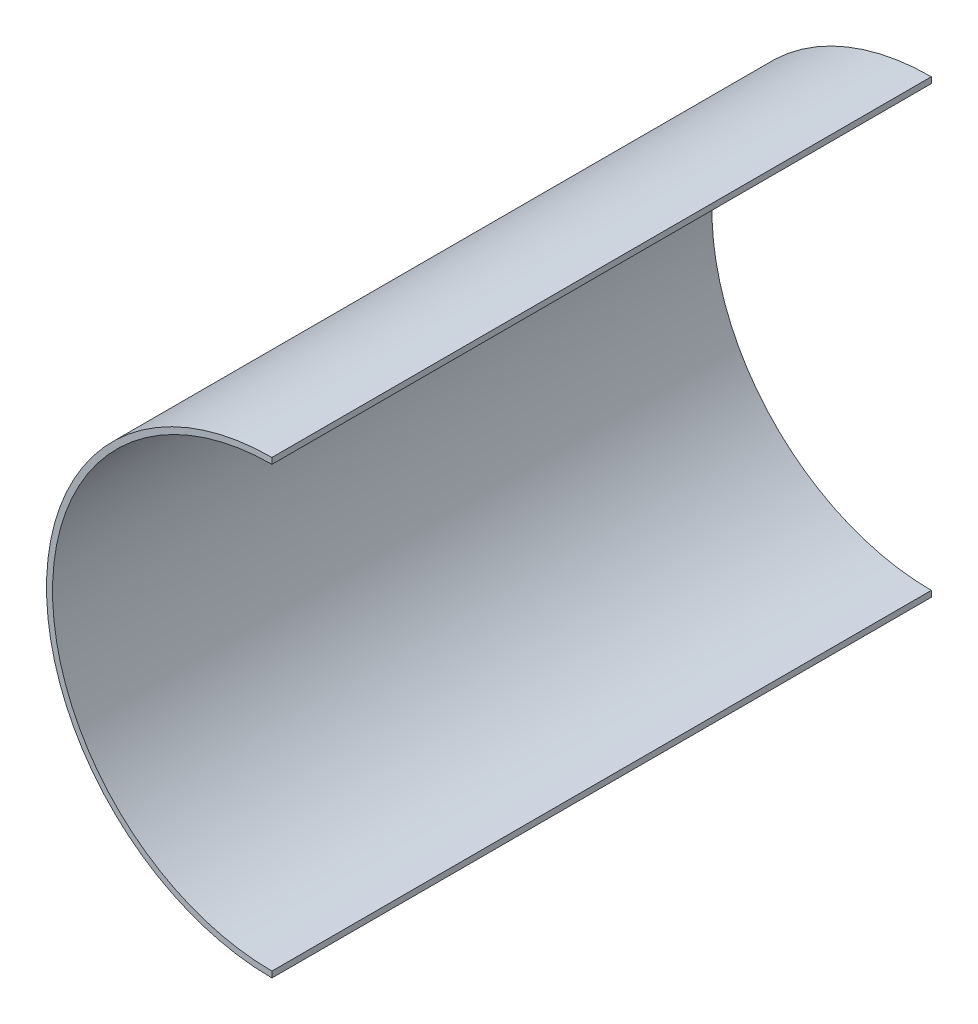
ISO-10303-21;
HEADER;
FILE_DESCRIPTION(('STEP AP214'),'2;1');
FILE_NAME('part.step','',(''),(''),'','','');
FILE_SCHEMA(('AUTOMOTIVE_DESIGN { 1 0 10303 214 1 1 1 1 }'));
ENDSEC;
DATA;
#1=APPLICATION_CONTEXT('core data for automotive mechanical design processes');
#2=APPLICATION_PROTOCOL_DEFINITION('international standard','automotive_design',2000,#1);
#3=PRODUCT_CONTEXT('',#1,'mechanical');
#4=PRODUCT('Part','Part','',(#3));
#5=PRODUCT_RELATED_PRODUCT_CATEGORY('part','',(#4));
#6=PRODUCT_DEFINITION_FORMATION('','',#4);
#7=PRODUCT_DEFINITION_CONTEXT('part definition',#1,'design');
#8=PRODUCT_DEFINITION('design','',#6,#7);
#9=PRODUCT_DEFINITION_SHAPE('','',#8);
#10=(LENGTH_UNIT() NAMED_UNIT(*) SI_UNIT(.MILLI.,.METRE.));
#11=(NAMED_UNIT(*) PLANE_ANGLE_UNIT() SI_UNIT($,.RADIAN.));
#12=(NAMED_UNIT(*) SI_UNIT($,.STERADIAN.) SOLID_ANGLE_UNIT());
#13=UNCERTAINTY_MEASURE_WITH_UNIT(LENGTH_MEASURE(1.E-05),#10,'distance_accuracy_value','');
#14=(GEOMETRIC_REPRESENTATION_CONTEXT(3) GLOBAL_UNCERTAINTY_ASSIGNED_CONTEXT((#13)) GLOBAL_UNIT_ASSIGNED_CONTEXT((#10,
#11,#12)) REPRESENTATION_CONTEXT('',''));
#15=CARTESIAN_POINT('',(0.,0.,0.));
#16=DIRECTION('',(0.,0.,1.));
#17=DIRECTION('',(1.,0.,0.));
#18=AXIS2_PLACEMENT_3D('',#15,#16,#17);
#19=CARTESIAN_POINT('',(0.,0.,448.06869685399));
#20=DIRECTION('',(0.,0.,-1.));
#21=DIRECTION('',(-1.,0.,0.));
#22=AXIS2_PLACEMENT_3D('',#19,#20,#21);
#23=CYLINDRICAL_SURFACE('',#22,75.);
#24=DIRECTION('',(0.,0.,-1.));
#25=VECTOR('',#24,1.);
#26=CARTESIAN_POINT('',(-2.45324106463415E-12,75.,448.06869685399));
#27=LINE('',#26,#25);
#28=CARTESIAN_POINT('',(0.,75.,16.5516691683784));
#29=VERTEX_POINT('',#28);
#30=CARTESIAN_POINT('',(4.44522754626437E-12,75.0000000000034,235.936662498026));
#31=VERTEX_POINT('',#30);
#32=EDGE_CURVE('E64',#29,#31,#27,.F.);
#33=ORIENTED_EDGE('',*,*,#32,.F.);
#34=CARTESIAN_POINT('',(0.,0.,16.5516691683784));
#35=DIRECTION('',(0.,0.,-1.));
#36=DIRECTION('',(-1.,0.,0.));
#37=AXIS2_PLACEMENT_3D('',#34,#35,#36);
#38=CIRCLE('',#37,75.);
#39=CARTESIAN_POINT('',(0.,-75.,16.5516691683783));
#40=VERTEX_POINT('',#39);
#41=EDGE_CURVE('E99',#40,#29,#38,.T.);
#42=ORIENTED_EDGE('',*,*,#41,.F.);
#43=DIRECTION('',(0.,0.,-1.));
#44=VECTOR('',#43,1.);
#45=CARTESIAN_POINT('',(-2.43487136264694E-12,-75.,448.06869685399));
#46=LINE('',#45,#44);
#47=CARTESIAN_POINT('',(-2.43487136264694E-12,-74.9999999999966,235.936662498026));
#48=VERTEX_POINT('',#47);
#49=EDGE_CURVE('E103',#48,#40,#46,.T.);
#50=ORIENTED_EDGE('',*,*,#49,.F.);
#51=CARTESIAN_POINT('',(4.49323060614543E-12,3.39843537323899E-12,235.936662498026));
#52=DIRECTION('',(0.,0.,1.));
#53=DIRECTION('',(-0.231139563416452,0.972920604275422,0.));
#54=AXIS2_PLACEMENT_3D('',#51,#52,#53);
#55=CIRCLE('',#54,75.);
#56=EDGE_CURVE('E97',#31,#48,#55,.T.);
#57=ORIENTED_EDGE('',*,*,#56,.F.);
#58=EDGE_LOOP('',(#33,#42,#50,#57));
#59=FACE_BOUND('',#58,.T.);
#60=ADVANCED_FACE('F43',(#59),#23,.T.);
#61=CARTESIAN_POINT('',(0.,0.,448.06869685399));
#62=DIRECTION('',(0.,0.,-1.));
#63=DIRECTION('',(-1.,0.,0.));
#64=AXIS2_PLACEMENT_3D('',#61,#62,#63);
#65=CYLINDRICAL_SURFACE('',#64,73.);
#66=CARTESIAN_POINT('',(0.,0.,16.5516691683784));
#67=DIRECTION('',(0.,0.,-1.));
#68=DIRECTION('',(-1.,0.,0.));
#69=AXIS2_PLACEMENT_3D('',#66,#67,#68);
#70=CIRCLE('',#69,73.);
#71=CARTESIAN_POINT('',(0.,-73.,16.5516691683783));
#72=VERTEX_POINT('',#71);
#73=CARTESIAN_POINT('',(0.,73.,16.5516691683784));
#74=VERTEX_POINT('',#73);
#75=EDGE_CURVE('E93',#72,#74,#70,.T.);
#76=ORIENTED_EDGE('',*,*,#75,.T.);
#77=DIRECTION('',(0.,0.,-1.));
#78=VECTOR('',#77,1.);
#79=CARTESIAN_POINT('',(-2.45299613527432E-12,73.,448.06869685399));
#80=LINE('',#79,#78);
#81=CARTESIAN_POINT('',(-2.45299613527432E-12,73.0000000000033,235.936662498026));
#82=VERTEX_POINT('',#81);
#83=EDGE_CURVE('E81',#74,#82,#80,.F.);
#84=ORIENTED_EDGE('',*,*,#83,.T.);
#85=CARTESIAN_POINT('',(4.49323060614543E-12,3.39843537323899E-12,235.936662498026));
#86=DIRECTION('',(0.,0.,1.));
#87=DIRECTION('',(-0.231139563416452,0.972920604275422,0.));
#88=AXIS2_PLACEMENT_3D('',#85,#86,#87);
#89=CIRCLE('',#88,73.);
#90=CARTESIAN_POINT('',(4.46335231889175E-12,-72.9999999999966,235.936662498026));
#91=VERTEX_POINT('',#90);
#92=EDGE_CURVE('E91',#82,#91,#89,.T.);
#93=ORIENTED_EDGE('',*,*,#92,.T.);
#94=DIRECTION('',(0.,0.,-1.));
#95=VECTOR('',#94,1.);
#96=CARTESIAN_POINT('',(-2.43511629200677E-12,-73.,448.06869685399));
#97=LINE('',#96,#95);
#98=EDGE_CURVE('E57',#91,#72,#97,.T.);
#99=ORIENTED_EDGE('',*,*,#98,.T.);
#100=EDGE_LOOP('',(#76,#84,#93,#99));
#101=FACE_BOUND('',#100,.T.);
#102=ADVANCED_FACE('F90',(#101),#65,.F.);
#103=CARTESIAN_POINT('',(0.,0.,16.5516691683784));
#104=DIRECTION('',(0.,0.,-1.));
#105=DIRECTION('',(-1.,0.,0.));
#106=AXIS2_PLACEMENT_3D('',#103,#104,#105);
#107=PLANE('',#106);
#108=DIRECTION('',(0.,1.,0.));
#109=VECTOR('',#108,1.);
#110=CARTESIAN_POINT('',(0.,0.,16.5516691683784));
#111=LINE('',#110,#109);
#112=EDGE_CURVE('E109',#40,#72,#111,.T.);
#113=ORIENTED_EDGE('',*,*,#112,.F.);
#114=ORIENTED_EDGE('',*,*,#41,.T.);
#115=EDGE_CURVE('E94',#74,#29,#111,.T.);
#116=ORIENTED_EDGE('',*,*,#115,.F.);
#117=ORIENTED_EDGE('',*,*,#75,.F.);
#118=EDGE_LOOP('',(#113,#114,#116,#117));
#119=FACE_BOUND('',#118,.T.);
#120=ADVANCED_FACE('F108',(#119),#107,.T.);
#121=CARTESIAN_POINT('',(4.45441239725797E-12,3.38921321902062E-12,235.936662498026));
#122=DIRECTION('',(0.,0.,1.));
#123=DIRECTION('',(-0.231139563416452,0.972920604275422,0.));
#124=AXIS2_PLACEMENT_3D('',#121,#122,#123);
#125=PLANE('',#124);
#126=DIRECTION('',(0.,-1.,0.));
#127=VECTOR('',#126,1.);
#128=CARTESIAN_POINT('',(4.45441239725797E-12,3.38921321902062E-12,235.936662498026));
#129=LINE('',#128,#127);
#130=EDGE_CURVE('E12',#31,#82,#129,.T.);
#131=ORIENTED_EDGE('',*,*,#130,.F.);
#132=ORIENTED_EDGE('',*,*,#56,.T.);
#133=EDGE_CURVE('E46',#91,#48,#129,.T.);
#134=ORIENTED_EDGE('',*,*,#133,.F.);
#135=ORIENTED_EDGE('',*,*,#92,.F.);
#136=EDGE_LOOP('',(#131,#132,#134,#135));
#137=FACE_BOUND('',#136,.T.);
#138=ADVANCED_FACE('F96',(#137),#125,.T.);
#139=CARTESIAN_POINT('',(-2.43303439244822E-12,-90.0000000000006,-155.063337501974));
#140=DIRECTION('',(-1.,0.,0.));
#141=DIRECTION('',(0.,-1.,0.));
#142=AXIS2_PLACEMENT_3D('',#139,#140,#141);
#143=PLANE('',#142);
#144=ORIENTED_EDGE('',*,*,#49,.T.);
#145=ORIENTED_EDGE('',*,*,#112,.T.);
#146=ORIENTED_EDGE('',*,*,#98,.F.);
#147=ORIENTED_EDGE('',*,*,#133,.T.);
#148=EDGE_LOOP('',(#144,#145,#146,#147));
#149=FACE_BOUND('',#148,.T.);
#150=ADVANCED_FACE('F115',(#149),#143,.F.);
#151=ORIENTED_EDGE('',*,*,#32,.T.);
#152=ORIENTED_EDGE('',*,*,#130,.T.);
#153=ORIENTED_EDGE('',*,*,#83,.F.);
#154=ORIENTED_EDGE('',*,*,#115,.T.);
#155=EDGE_LOOP('',(#151,#152,#153,#154));
#156=FACE_BOUND('',#155,.T.);
#157=ADVANCED_FACE('F80',(#156),#143,.F.);
#158=CLOSED_SHELL('',(#60,#102,#120,#138,#150,#157));
#159=MANIFOLD_SOLID_BREP('B2',#158);
#160=ADVANCED_BREP_SHAPE_REPRESENTATION('',(#18,#159),#14);
#161=SHAPE_DEFINITION_REPRESENTATION(#9,#160);
ENDSEC;
END-ISO-10303-21;
